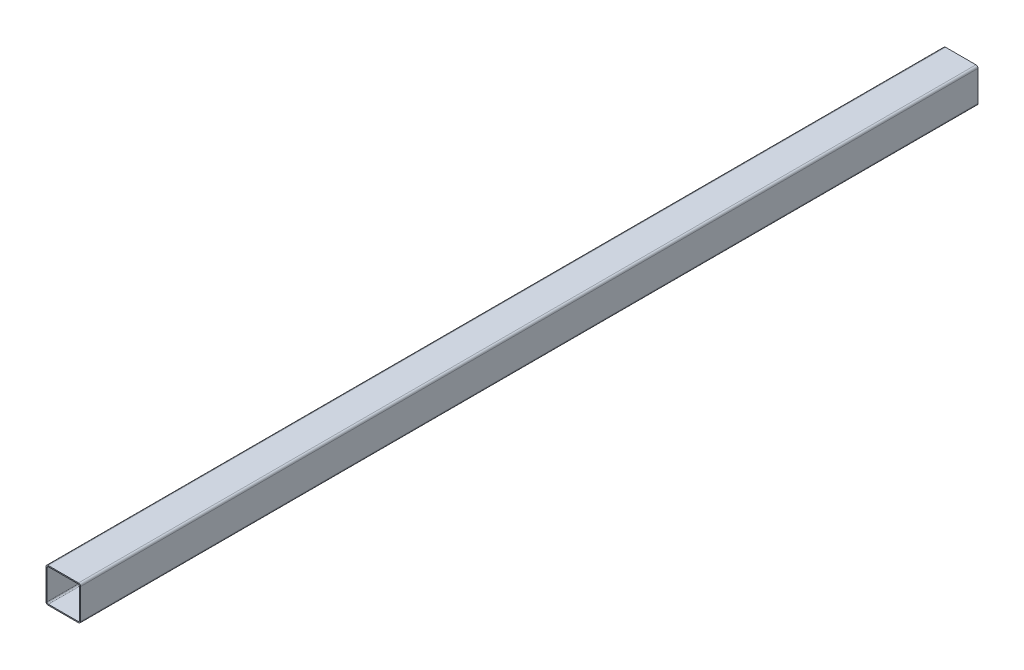
ISO-10303-21;
HEADER;
FILE_DESCRIPTION(('STEP AP214'),'2;1');
FILE_NAME('part.step','',(''),(''),'','','');
FILE_SCHEMA(('AUTOMOTIVE_DESIGN { 1 0 10303 214 1 1 1 1 }'));
ENDSEC;
DATA;
#1=APPLICATION_CONTEXT('core data for automotive mechanical design processes');
#2=APPLICATION_PROTOCOL_DEFINITION('international standard','automotive_design',2000,#1);
#3=PRODUCT_CONTEXT('',#1,'mechanical');
#4=PRODUCT('Part','Part','',(#3));
#5=PRODUCT_RELATED_PRODUCT_CATEGORY('part','',(#4));
#6=PRODUCT_DEFINITION_FORMATION('','',#4);
#7=PRODUCT_DEFINITION_CONTEXT('part definition',#1,'design');
#8=PRODUCT_DEFINITION('design','',#6,#7);
#9=PRODUCT_DEFINITION_SHAPE('','',#8);
#10=(LENGTH_UNIT() NAMED_UNIT(*) SI_UNIT(.MILLI.,.METRE.));
#11=(NAMED_UNIT(*) PLANE_ANGLE_UNIT() SI_UNIT($,.RADIAN.));
#12=(NAMED_UNIT(*) SI_UNIT($,.STERADIAN.) SOLID_ANGLE_UNIT());
#13=UNCERTAINTY_MEASURE_WITH_UNIT(LENGTH_MEASURE(1.E-05),#10,'distance_accuracy_value','');
#14=(GEOMETRIC_REPRESENTATION_CONTEXT(3) GLOBAL_UNCERTAINTY_ASSIGNED_CONTEXT((#13)) GLOBAL_UNIT_ASSIGNED_CONTEXT((#10,
#11,#12)) REPRESENTATION_CONTEXT('',''));
#15=CARTESIAN_POINT('',(0.,0.,0.));
#16=DIRECTION('',(0.,0.,1.));
#17=DIRECTION('',(1.,0.,0.));
#18=AXIS2_PLACEMENT_3D('',#15,#16,#17);
#19=CARTESIAN_POINT('',(-44.0000000000005,-43.9999999999965,-2600.));
#20=DIRECTION('',(0.,0.,1.));
#21=DIRECTION('',(1.,0.,0.));
#22=AXIS2_PLACEMENT_3D('',#19,#20,#21);
#23=CYLINDRICAL_SURFACE('',#22,6.00000000000014);
#24=CARTESIAN_POINT('',(-44.0000000000005,-43.9999999999965,0.));
#25=DIRECTION('',(0.,0.,1.));
#26=DIRECTION('',(1.,0.,0.));
#27=AXIS2_PLACEMENT_3D('',#24,#25,#26);
#28=CIRCLE('',#27,6.00000000000014);
#29=CARTESIAN_POINT('',(-50.0000000000007,-43.9999999999965,0.));
#30=VERTEX_POINT('',#29);
#31=CARTESIAN_POINT('',(-44.0000000000005,-49.9999999999966,0.));
#32=VERTEX_POINT('',#31);
#33=EDGE_CURVE('E205',#30,#32,#28,.T.);
#34=ORIENTED_EDGE('',*,*,#33,.F.);
#35=DIRECTION('',(0.,0.,1.));
#36=VECTOR('',#35,1.);
#37=CARTESIAN_POINT('',(-50.0000000000007,-43.9999999999965,-2600.));
#38=LINE('',#37,#36);
#39=CARTESIAN_POINT('',(-50.0000000000007,-43.9999999999965,-2600.));
#40=VERTEX_POINT('',#39);
#41=EDGE_CURVE('E11',#40,#30,#38,.T.);
#42=ORIENTED_EDGE('',*,*,#41,.F.);
#43=CARTESIAN_POINT('',(-44.0000000000005,-43.9999999999965,-2600.));
#44=DIRECTION('',(0.,0.,1.));
#45=DIRECTION('',(1.,0.,0.));
#46=AXIS2_PLACEMENT_3D('',#43,#44,#45);
#47=CIRCLE('',#46,6.00000000000014);
#48=CARTESIAN_POINT('',(-44.0000000000005,-49.9999999999966,-2600.));
#49=VERTEX_POINT('',#48);
#50=EDGE_CURVE('E217',#40,#49,#47,.T.);
#51=ORIENTED_EDGE('',*,*,#50,.T.);
#52=DIRECTION('',(0.,0.,1.));
#53=VECTOR('',#52,1.);
#54=CARTESIAN_POINT('',(-44.0000000000005,-49.9999999999966,-2600.));
#55=LINE('',#54,#53);
#56=EDGE_CURVE('E38',#49,#32,#55,.T.);
#57=ORIENTED_EDGE('',*,*,#56,.T.);
#58=EDGE_LOOP('',(#34,#42,#51,#57));
#59=FACE_BOUND('',#58,.T.);
#60=ADVANCED_FACE('F35',(#59),#23,.T.);
#61=CARTESIAN_POINT('',(-50.0000000000007,44.0000000000034,-2600.));
#62=DIRECTION('',(-1.,0.,0.));
#63=DIRECTION('',(0.,0.,1.));
#64=AXIS2_PLACEMENT_3D('',#61,#62,#63);
#65=PLANE('',#64);
#66=DIRECTION('',(0.,-1.,0.));
#67=VECTOR('',#66,1.);
#68=CARTESIAN_POINT('',(-50.0000000000007,44.0000000000034,0.));
#69=LINE('',#68,#67);
#70=CARTESIAN_POINT('',(-50.0000000000007,44.0000000000034,0.));
#71=VERTEX_POINT('',#70);
#72=EDGE_CURVE('E221',#71,#30,#69,.T.);
#73=ORIENTED_EDGE('',*,*,#72,.F.);
#74=DIRECTION('',(0.,0.,1.));
#75=VECTOR('',#74,1.);
#76=CARTESIAN_POINT('',(-50.0000000000007,44.0000000000034,-2600.));
#77=LINE('',#76,#75);
#78=CARTESIAN_POINT('',(-50.0000000000007,44.0000000000034,-2600.));
#79=VERTEX_POINT('',#78);
#80=EDGE_CURVE('E43',#79,#71,#77,.T.);
#81=ORIENTED_EDGE('',*,*,#80,.F.);
#82=DIRECTION('',(0.,-1.,0.));
#83=VECTOR('',#82,1.);
#84=CARTESIAN_POINT('',(-50.0000000000007,44.0000000000034,-2600.));
#85=LINE('',#84,#83);
#86=EDGE_CURVE('E239',#79,#40,#85,.T.);
#87=ORIENTED_EDGE('',*,*,#86,.T.);
#88=ORIENTED_EDGE('',*,*,#41,.T.);
#89=EDGE_LOOP('',(#73,#81,#87,#88));
#90=FACE_BOUND('',#89,.T.);
#91=ADVANCED_FACE('F286',(#90),#65,.T.);
#92=CARTESIAN_POINT('',(-44.0000000000005,44.0000000000034,-2600.));
#93=DIRECTION('',(0.,0.,1.));
#94=DIRECTION('',(1.,0.,0.));
#95=AXIS2_PLACEMENT_3D('',#92,#93,#94);
#96=CYLINDRICAL_SURFACE('',#95,6.00000000000014);
#97=CARTESIAN_POINT('',(-44.0000000000005,44.0000000000034,0.));
#98=DIRECTION('',(0.,0.,1.));
#99=DIRECTION('',(1.,0.,0.));
#100=AXIS2_PLACEMENT_3D('',#97,#98,#99);
#101=CIRCLE('',#100,6.00000000000014);
#102=CARTESIAN_POINT('',(-44.0000000000005,50.0000000000036,0.));
#103=VERTEX_POINT('',#102);
#104=EDGE_CURVE('E259',#103,#71,#101,.T.);
#105=ORIENTED_EDGE('',*,*,#104,.F.);
#106=DIRECTION('',(0.,0.,1.));
#107=VECTOR('',#106,1.);
#108=CARTESIAN_POINT('',(-44.0000000000005,50.0000000000036,-2600.));
#109=LINE('',#108,#107);
#110=CARTESIAN_POINT('',(-44.0000000000005,50.0000000000036,-2600.));
#111=VERTEX_POINT('',#110);
#112=EDGE_CURVE('E265',#111,#103,#109,.T.);
#113=ORIENTED_EDGE('',*,*,#112,.F.);
#114=CARTESIAN_POINT('',(-44.0000000000005,44.0000000000034,-2600.));
#115=DIRECTION('',(0.,0.,1.));
#116=DIRECTION('',(1.,0.,0.));
#117=AXIS2_PLACEMENT_3D('',#114,#115,#116);
#118=CIRCLE('',#117,6.00000000000014);
#119=EDGE_CURVE('E236',#111,#79,#118,.T.);
#120=ORIENTED_EDGE('',*,*,#119,.T.);
#121=ORIENTED_EDGE('',*,*,#80,.T.);
#122=EDGE_LOOP('',(#105,#113,#120,#121));
#123=FACE_BOUND('',#122,.T.);
#124=ADVANCED_FACE('F305',(#123),#96,.T.);
#125=CARTESIAN_POINT('',(-44.0000000000005,50.0000000000035,-2600.));
#126=DIRECTION('',(0.,1.,0.));
#127=DIRECTION('',(0.,0.,1.));
#128=AXIS2_PLACEMENT_3D('',#125,#126,#127);
#129=PLANE('',#128);
#130=DIRECTION('',(-1.,0.,0.));
#131=VECTOR('',#130,1.);
#132=CARTESIAN_POINT('',(-44.0000000000005,50.0000000000035,0.));
#133=LINE('',#132,#131);
#134=CARTESIAN_POINT('',(43.9999999999987,50.0000000000035,0.));
#135=VERTEX_POINT('',#134);
#136=EDGE_CURVE('E256',#135,#103,#133,.T.);
#137=ORIENTED_EDGE('',*,*,#136,.F.);
#138=DIRECTION('',(0.,0.,1.));
#139=VECTOR('',#138,1.);
#140=CARTESIAN_POINT('',(43.9999999999987,50.0000000000035,-2600.));
#141=LINE('',#140,#139);
#142=CARTESIAN_POINT('',(43.9999999999987,50.0000000000035,-2600.));
#143=VERTEX_POINT('',#142);
#144=EDGE_CURVE('E267',#143,#135,#141,.T.);
#145=ORIENTED_EDGE('',*,*,#144,.F.);
#146=DIRECTION('',(-1.,0.,0.));
#147=VECTOR('',#146,1.);
#148=CARTESIAN_POINT('',(-44.0000000000005,50.0000000000035,-2600.));
#149=LINE('',#148,#147);
#150=EDGE_CURVE('E233',#143,#111,#149,.T.);
#151=ORIENTED_EDGE('',*,*,#150,.T.);
#152=ORIENTED_EDGE('',*,*,#112,.T.);
#153=EDGE_LOOP('',(#137,#145,#151,#152));
#154=FACE_BOUND('',#153,.T.);
#155=ADVANCED_FACE('F303',(#154),#129,.T.);
#156=CARTESIAN_POINT('',(43.9999999999987,44.0000000000034,-2600.));
#157=DIRECTION('',(0.,0.,1.));
#158=DIRECTION('',(1.,0.,0.));
#159=AXIS2_PLACEMENT_3D('',#156,#157,#158);
#160=CYLINDRICAL_SURFACE('',#159,6.00000000000014);
#161=CARTESIAN_POINT('',(43.9999999999987,44.0000000000034,0.));
#162=DIRECTION('',(0.,0.,1.));
#163=DIRECTION('',(-1.,0.,0.));
#164=AXIS2_PLACEMENT_3D('',#161,#162,#163);
#165=CIRCLE('',#164,6.00000000000014);
#166=CARTESIAN_POINT('',(49.9999999999988,44.0000000000034,0.));
#167=VERTEX_POINT('',#166);
#168=EDGE_CURVE('E253',#167,#135,#165,.T.);
#169=ORIENTED_EDGE('',*,*,#168,.F.);
#170=DIRECTION('',(0.,0.,1.));
#171=VECTOR('',#170,1.);
#172=CARTESIAN_POINT('',(49.9999999999988,44.0000000000034,-2600.));
#173=LINE('',#172,#171);
#174=CARTESIAN_POINT('',(49.9999999999988,44.0000000000034,-2600.));
#175=VERTEX_POINT('',#174);
#176=EDGE_CURVE('E269',#175,#167,#173,.T.);
#177=ORIENTED_EDGE('',*,*,#176,.F.);
#178=CARTESIAN_POINT('',(43.9999999999987,44.0000000000034,-2600.));
#179=DIRECTION('',(0.,0.,1.));
#180=DIRECTION('',(-1.,0.,0.));
#181=AXIS2_PLACEMENT_3D('',#178,#179,#180);
#182=CIRCLE('',#181,6.00000000000014);
#183=EDGE_CURVE('E230',#175,#143,#182,.T.);
#184=ORIENTED_EDGE('',*,*,#183,.T.);
#185=ORIENTED_EDGE('',*,*,#144,.T.);
#186=EDGE_LOOP('',(#169,#177,#184,#185));
#187=FACE_BOUND('',#186,.T.);
#188=ADVANCED_FACE('F299',(#187),#160,.T.);
#189=CARTESIAN_POINT('',(49.9999999999989,44.0000000000034,-2600.));
#190=DIRECTION('',(1.,0.,0.));
#191=DIRECTION('',(0.,0.,-1.));
#192=AXIS2_PLACEMENT_3D('',#189,#190,#191);
#193=PLANE('',#192);
#194=DIRECTION('',(0.,1.,0.));
#195=VECTOR('',#194,1.);
#196=CARTESIAN_POINT('',(49.9999999999989,44.0000000000034,0.));
#197=LINE('',#196,#195);
#198=CARTESIAN_POINT('',(49.9999999999989,-43.9999999999965,0.));
#199=VERTEX_POINT('',#198);
#200=EDGE_CURVE('E250',#199,#167,#197,.T.);
#201=ORIENTED_EDGE('',*,*,#200,.F.);
#202=DIRECTION('',(0.,0.,1.));
#203=VECTOR('',#202,1.);
#204=CARTESIAN_POINT('',(49.9999999999989,-43.9999999999965,-2600.));
#205=LINE('',#204,#203);
#206=CARTESIAN_POINT('',(49.9999999999989,-43.9999999999965,-2600.));
#207=VERTEX_POINT('',#206);
#208=EDGE_CURVE('E271',#207,#199,#205,.T.);
#209=ORIENTED_EDGE('',*,*,#208,.F.);
#210=DIRECTION('',(0.,1.,0.));
#211=VECTOR('',#210,1.);
#212=CARTESIAN_POINT('',(49.9999999999989,44.0000000000034,-2600.));
#213=LINE('',#212,#211);
#214=EDGE_CURVE('E227',#207,#175,#213,.T.);
#215=ORIENTED_EDGE('',*,*,#214,.T.);
#216=ORIENTED_EDGE('',*,*,#176,.T.);
#217=EDGE_LOOP('',(#201,#209,#215,#216));
#218=FACE_BOUND('',#217,.T.);
#219=ADVANCED_FACE('F297',(#218),#193,.T.);
#220=CARTESIAN_POINT('',(43.9999999999987,-43.9999999999965,-2600.));
#221=DIRECTION('',(0.,0.,1.));
#222=DIRECTION('',(1.,0.,0.));
#223=AXIS2_PLACEMENT_3D('',#220,#221,#222);
#224=CYLINDRICAL_SURFACE('',#223,6.00000000000014);
#225=CARTESIAN_POINT('',(43.9999999999987,-43.9999999999965,0.));
#226=DIRECTION('',(0.,0.,1.));
#227=DIRECTION('',(1.,0.,0.));
#228=AXIS2_PLACEMENT_3D('',#225,#226,#227);
#229=CIRCLE('',#228,6.00000000000014);
#230=CARTESIAN_POINT('',(43.9999999999987,-49.9999999999967,0.));
#231=VERTEX_POINT('',#230);
#232=EDGE_CURVE('E247',#231,#199,#229,.T.);
#233=ORIENTED_EDGE('',*,*,#232,.F.);
#234=DIRECTION('',(0.,0.,1.));
#235=VECTOR('',#234,1.);
#236=CARTESIAN_POINT('',(43.9999999999987,-49.9999999999967,-2600.));
#237=LINE('',#236,#235);
#238=CARTESIAN_POINT('',(43.9999999999987,-49.9999999999967,-2600.));
#239=VERTEX_POINT('',#238);
#240=EDGE_CURVE('E272',#239,#231,#237,.T.);
#241=ORIENTED_EDGE('',*,*,#240,.F.);
#242=CARTESIAN_POINT('',(43.9999999999987,-43.9999999999965,-2600.));
#243=DIRECTION('',(0.,0.,1.));
#244=DIRECTION('',(1.,0.,0.));
#245=AXIS2_PLACEMENT_3D('',#242,#243,#244);
#246=CIRCLE('',#245,6.00000000000014);
#247=EDGE_CURVE('E224',#239,#207,#246,.T.);
#248=ORIENTED_EDGE('',*,*,#247,.T.);
#249=ORIENTED_EDGE('',*,*,#208,.T.);
#250=EDGE_LOOP('',(#233,#241,#248,#249));
#251=FACE_BOUND('',#250,.T.);
#252=ADVANCED_FACE('F293',(#251),#224,.T.);
#253=CARTESIAN_POINT('',(-44.0000000000005,-49.9999999999966,-2600.));
#254=DIRECTION('',(0.,-1.,0.));
#255=DIRECTION('',(0.,0.,-1.));
#256=AXIS2_PLACEMENT_3D('',#253,#254,#255);
#257=PLANE('',#256);
#258=DIRECTION('',(1.,0.,0.));
#259=VECTOR('',#258,1.);
#260=CARTESIAN_POINT('',(-44.0000000000005,-49.9999999999966,0.));
#261=LINE('',#260,#259);
#262=EDGE_CURVE('E244',#32,#231,#261,.T.);
#263=ORIENTED_EDGE('',*,*,#262,.F.);
#264=ORIENTED_EDGE('',*,*,#56,.F.);
#265=DIRECTION('',(1.,0.,0.));
#266=VECTOR('',#265,1.);
#267=CARTESIAN_POINT('',(-44.0000000000005,-49.9999999999966,-2600.));
#268=LINE('',#267,#266);
#269=EDGE_CURVE('E220',#49,#239,#268,.T.);
#270=ORIENTED_EDGE('',*,*,#269,.T.);
#271=ORIENTED_EDGE('',*,*,#240,.T.);
#272=EDGE_LOOP('',(#263,#264,#270,#271));
#273=FACE_BOUND('',#272,.T.);
#274=ADVANCED_FACE('F280',(#273),#257,.T.);
#275=CARTESIAN_POINT('',(-44.0000000000005,-43.9999999999965,-2600.));
#276=DIRECTION('',(0.,0.,1.));
#277=DIRECTION('',(1.,0.,0.));
#278=AXIS2_PLACEMENT_3D('',#275,#276,#277);
#279=PLANE('',#278);
#280=DIRECTION('',(0.,-1.,0.));
#281=VECTOR('',#280,1.);
#282=CARTESIAN_POINT('',(-47.0000000000009,43.0000000000035,-2600.));
#283=LINE('',#282,#281);
#284=CARTESIAN_POINT('',(-47.0000000000009,43.0000000000035,-2600.));
#285=VERTEX_POINT('',#284);
#286=CARTESIAN_POINT('',(-47.0000000000009,-42.9999999999966,-2600.));
#287=VERTEX_POINT('',#286);
#288=EDGE_CURVE('E156',#285,#287,#283,.T.);
#289=ORIENTED_EDGE('',*,*,#288,.T.);
#290=CARTESIAN_POINT('',(-43.0000000000009,-42.9999999999966,-2600.));
#291=DIRECTION('',(0.,0.,1.));
#292=DIRECTION('',(1.,0.,0.));
#293=AXIS2_PLACEMENT_3D('',#290,#291,#292);
#294=CIRCLE('',#293,4.);
#295=CARTESIAN_POINT('',(-43.0000000000009,-46.9999999999966,-2600.));
#296=VERTEX_POINT('',#295);
#297=EDGE_CURVE('E150',#287,#296,#294,.T.);
#298=ORIENTED_EDGE('',*,*,#297,.T.);
#299=DIRECTION('',(1.,0.,0.));
#300=VECTOR('',#299,1.);
#301=CARTESIAN_POINT('',(-43.0000000000009,-46.9999999999966,-2600.));
#302=LINE('',#301,#300);
#303=CARTESIAN_POINT('',(42.9999999999991,-46.9999999999966,-2600.));
#304=VERTEX_POINT('',#303);
#305=EDGE_CURVE('E159',#296,#304,#302,.T.);
#306=ORIENTED_EDGE('',*,*,#305,.T.);
#307=CARTESIAN_POINT('',(42.9999999999991,-42.9999999999966,-2600.));
#308=DIRECTION('',(0.,0.,1.));
#309=DIRECTION('',(1.,0.,0.));
#310=AXIS2_PLACEMENT_3D('',#307,#308,#309);
#311=CIRCLE('',#310,4.);
#312=CARTESIAN_POINT('',(46.9999999999991,-42.9999999999966,-2600.));
#313=VERTEX_POINT('',#312);
#314=EDGE_CURVE('E51',#304,#313,#311,.T.);
#315=ORIENTED_EDGE('',*,*,#314,.T.);
#316=DIRECTION('',(0.,1.,0.));
#317=VECTOR('',#316,1.);
#318=CARTESIAN_POINT('',(46.9999999999991,43.0000000000035,-2600.));
#319=LINE('',#318,#317);
#320=CARTESIAN_POINT('',(46.9999999999991,43.0000000000035,-2600.));
#321=VERTEX_POINT('',#320);
#322=EDGE_CURVE('E174',#313,#321,#319,.T.);
#323=ORIENTED_EDGE('',*,*,#322,.T.);
#324=CARTESIAN_POINT('',(42.9999999999991,43.0000000000035,-2600.));
#325=DIRECTION('',(0.,0.,1.));
#326=DIRECTION('',(-1.,0.,0.));
#327=AXIS2_PLACEMENT_3D('',#324,#325,#326);
#328=CIRCLE('',#327,4.);
#329=CARTESIAN_POINT('',(42.9999999999991,47.0000000000035,-2600.));
#330=VERTEX_POINT('',#329);
#331=EDGE_CURVE('E177',#321,#330,#328,.T.);
#332=ORIENTED_EDGE('',*,*,#331,.T.);
#333=DIRECTION('',(-1.,0.,0.));
#334=VECTOR('',#333,1.);
#335=CARTESIAN_POINT('',(-43.0000000000009,47.0000000000035,-2600.));
#336=LINE('',#335,#334);
#337=CARTESIAN_POINT('',(-43.0000000000009,47.0000000000035,-2600.));
#338=VERTEX_POINT('',#337);
#339=EDGE_CURVE('E180',#330,#338,#336,.T.);
#340=ORIENTED_EDGE('',*,*,#339,.T.);
#341=CARTESIAN_POINT('',(-43.0000000000009,43.0000000000035,-2600.));
#342=DIRECTION('',(0.,0.,1.));
#343=DIRECTION('',(1.,0.,0.));
#344=AXIS2_PLACEMENT_3D('',#341,#342,#343);
#345=CIRCLE('',#344,4.);
#346=EDGE_CURVE('E183',#338,#285,#345,.T.);
#347=ORIENTED_EDGE('',*,*,#346,.T.);
#348=EDGE_LOOP('',(#289,#298,#306,#315,#323,#332,#340,#347));
#349=FACE_BOUND('',#348,.T.);
#350=ORIENTED_EDGE('',*,*,#50,.F.);
#351=ORIENTED_EDGE('',*,*,#86,.F.);
#352=ORIENTED_EDGE('',*,*,#119,.F.);
#353=ORIENTED_EDGE('',*,*,#150,.F.);
#354=ORIENTED_EDGE('',*,*,#183,.F.);
#355=ORIENTED_EDGE('',*,*,#214,.F.);
#356=ORIENTED_EDGE('',*,*,#247,.F.);
#357=ORIENTED_EDGE('',*,*,#269,.F.);
#358=EDGE_LOOP('',(#350,#351,#352,#353,#354,#355,#356,#357));
#359=FACE_BOUND('',#358,.T.);
#360=ADVANCED_FACE('F163',(#349,#359),#279,.F.);
#361=CARTESIAN_POINT('',(-44.0000000000005,-43.9999999999965,0.));
#362=DIRECTION('',(0.,0.,1.));
#363=DIRECTION('',(1.,0.,0.));
#364=AXIS2_PLACEMENT_3D('',#361,#362,#363);
#365=PLANE('',#364);
#366=CARTESIAN_POINT('',(-43.0000000000009,-42.9999999999966,0.));
#367=DIRECTION('',(0.,0.,1.));
#368=DIRECTION('',(1.,0.,0.));
#369=AXIS2_PLACEMENT_3D('',#366,#367,#368);
#370=CIRCLE('',#369,4.);
#371=CARTESIAN_POINT('',(-47.0000000000009,-42.9999999999966,0.));
#372=VERTEX_POINT('',#371);
#373=CARTESIAN_POINT('',(-43.0000000000009,-46.9999999999966,0.));
#374=VERTEX_POINT('',#373);
#375=EDGE_CURVE('E59',#372,#374,#370,.T.);
#376=ORIENTED_EDGE('',*,*,#375,.F.);
#377=DIRECTION('',(0.,-1.,0.));
#378=VECTOR('',#377,1.);
#379=CARTESIAN_POINT('',(-47.0000000000009,43.0000000000035,0.));
#380=LINE('',#379,#378);
#381=CARTESIAN_POINT('',(-47.0000000000009,43.0000000000035,0.));
#382=VERTEX_POINT('',#381);
#383=EDGE_CURVE('E167',#382,#372,#380,.T.);
#384=ORIENTED_EDGE('',*,*,#383,.F.);
#385=CARTESIAN_POINT('',(-43.0000000000009,43.0000000000035,0.));
#386=DIRECTION('',(0.,0.,1.));
#387=DIRECTION('',(1.,0.,0.));
#388=AXIS2_PLACEMENT_3D('',#385,#386,#387);
#389=CIRCLE('',#388,4.);
#390=CARTESIAN_POINT('',(-43.0000000000009,47.0000000000035,0.));
#391=VERTEX_POINT('',#390);
#392=EDGE_CURVE('E170',#391,#382,#389,.T.);
#393=ORIENTED_EDGE('',*,*,#392,.F.);
#394=DIRECTION('',(-1.,0.,0.));
#395=VECTOR('',#394,1.);
#396=CARTESIAN_POINT('',(-43.0000000000009,47.0000000000035,0.));
#397=LINE('',#396,#395);
#398=CARTESIAN_POINT('',(42.9999999999991,47.0000000000035,0.));
#399=VERTEX_POINT('',#398);
#400=EDGE_CURVE('E198',#399,#391,#397,.T.);
#401=ORIENTED_EDGE('',*,*,#400,.F.);
#402=CARTESIAN_POINT('',(42.9999999999991,43.0000000000035,0.));
#403=DIRECTION('',(0.,0.,1.));
#404=DIRECTION('',(-1.,0.,0.));
#405=AXIS2_PLACEMENT_3D('',#402,#403,#404);
#406=CIRCLE('',#405,4.);
#407=CARTESIAN_POINT('',(46.9999999999991,43.0000000000035,0.));
#408=VERTEX_POINT('',#407);
#409=EDGE_CURVE('E195',#408,#399,#406,.T.);
#410=ORIENTED_EDGE('',*,*,#409,.F.);
#411=DIRECTION('',(0.,1.,0.));
#412=VECTOR('',#411,1.);
#413=CARTESIAN_POINT('',(46.9999999999991,43.0000000000035,0.));
#414=LINE('',#413,#412);
#415=CARTESIAN_POINT('',(46.9999999999991,-42.9999999999966,0.));
#416=VERTEX_POINT('',#415);
#417=EDGE_CURVE('E192',#416,#408,#414,.T.);
#418=ORIENTED_EDGE('',*,*,#417,.F.);
#419=CARTESIAN_POINT('',(42.9999999999991,-42.9999999999966,0.));
#420=DIRECTION('',(0.,0.,1.));
#421=DIRECTION('',(1.,0.,0.));
#422=AXIS2_PLACEMENT_3D('',#419,#420,#421);
#423=CIRCLE('',#422,4.);
#424=CARTESIAN_POINT('',(42.9999999999991,-46.9999999999966,0.));
#425=VERTEX_POINT('',#424);
#426=EDGE_CURVE('E189',#425,#416,#423,.T.);
#427=ORIENTED_EDGE('',*,*,#426,.F.);
#428=DIRECTION('',(1.,0.,0.));
#429=VECTOR('',#428,1.);
#430=CARTESIAN_POINT('',(-43.0000000000009,-46.9999999999966,0.));
#431=LINE('',#430,#429);
#432=EDGE_CURVE('E187',#374,#425,#431,.T.);
#433=ORIENTED_EDGE('',*,*,#432,.F.);
#434=EDGE_LOOP('',(#376,#384,#393,#401,#410,#418,#427,#433));
#435=FACE_BOUND('',#434,.T.);
#436=ORIENTED_EDGE('',*,*,#33,.T.);
#437=ORIENTED_EDGE('',*,*,#262,.T.);
#438=ORIENTED_EDGE('',*,*,#232,.T.);
#439=ORIENTED_EDGE('',*,*,#200,.T.);
#440=ORIENTED_EDGE('',*,*,#168,.T.);
#441=ORIENTED_EDGE('',*,*,#136,.T.);
#442=ORIENTED_EDGE('',*,*,#104,.T.);
#443=ORIENTED_EDGE('',*,*,#72,.T.);
#444=EDGE_LOOP('',(#436,#437,#438,#439,#440,#441,#442,#443));
#445=FACE_BOUND('',#444,.T.);
#446=ADVANCED_FACE('F282',(#435,#445),#365,.T.);
#447=CARTESIAN_POINT('',(-43.0000000000009,-42.9999999999966,-2600.));
#448=DIRECTION('',(0.,0.,1.));
#449=DIRECTION('',(1.,0.,0.));
#450=AXIS2_PLACEMENT_3D('',#447,#448,#449);
#451=CYLINDRICAL_SURFACE('',#450,4.);
#452=ORIENTED_EDGE('',*,*,#375,.T.);
#453=DIRECTION('',(0.,0.,1.));
#454=VECTOR('',#453,1.);
#455=CARTESIAN_POINT('',(-43.0000000000009,-46.9999999999966,-2600.));
#456=LINE('',#455,#454);
#457=EDGE_CURVE('E146',#296,#374,#456,.T.);
#458=ORIENTED_EDGE('',*,*,#457,.F.);
#459=ORIENTED_EDGE('',*,*,#297,.F.);
#460=DIRECTION('',(0.,0.,1.));
#461=VECTOR('',#460,1.);
#462=CARTESIAN_POINT('',(-47.0000000000009,-42.9999999999966,-2600.));
#463=LINE('',#462,#461);
#464=EDGE_CURVE('E203',#287,#372,#463,.T.);
#465=ORIENTED_EDGE('',*,*,#464,.T.);
#466=EDGE_LOOP('',(#452,#458,#459,#465));
#467=FACE_BOUND('',#466,.T.);
#468=ADVANCED_FACE('F148',(#467),#451,.F.);
#469=CARTESIAN_POINT('',(-47.0000000000009,43.0000000000035,-2600.));
#470=DIRECTION('',(-1.,0.,0.));
#471=DIRECTION('',(0.,0.,1.));
#472=AXIS2_PLACEMENT_3D('',#469,#470,#471);
#473=PLANE('',#472);
#474=ORIENTED_EDGE('',*,*,#383,.T.);
#475=ORIENTED_EDGE('',*,*,#464,.F.);
#476=ORIENTED_EDGE('',*,*,#288,.F.);
#477=DIRECTION('',(0.,0.,1.));
#478=VECTOR('',#477,1.);
#479=CARTESIAN_POINT('',(-47.0000000000009,43.0000000000035,-2600.));
#480=LINE('',#479,#478);
#481=EDGE_CURVE('E206',#285,#382,#480,.T.);
#482=ORIENTED_EDGE('',*,*,#481,.T.);
#483=EDGE_LOOP('',(#474,#475,#476,#482));
#484=FACE_BOUND('',#483,.T.);
#485=ADVANCED_FACE('F388',(#484),#473,.F.);
#486=CARTESIAN_POINT('',(-43.0000000000009,43.0000000000035,-2600.));
#487=DIRECTION('',(0.,0.,1.));
#488=DIRECTION('',(1.,0.,0.));
#489=AXIS2_PLACEMENT_3D('',#486,#487,#488);
#490=CYLINDRICAL_SURFACE('',#489,4.);
#491=ORIENTED_EDGE('',*,*,#392,.T.);
#492=ORIENTED_EDGE('',*,*,#481,.F.);
#493=ORIENTED_EDGE('',*,*,#346,.F.);
#494=DIRECTION('',(0.,0.,1.));
#495=VECTOR('',#494,1.);
#496=CARTESIAN_POINT('',(-43.0000000000009,47.0000000000035,-2600.));
#497=LINE('',#496,#495);
#498=EDGE_CURVE('E208',#338,#391,#497,.T.);
#499=ORIENTED_EDGE('',*,*,#498,.T.);
#500=EDGE_LOOP('',(#491,#492,#493,#499));
#501=FACE_BOUND('',#500,.T.);
#502=ADVANCED_FACE('F397',(#501),#490,.F.);
#503=CARTESIAN_POINT('',(-43.0000000000009,47.0000000000035,-2600.));
#504=DIRECTION('',(0.,1.,0.));
#505=DIRECTION('',(0.,0.,1.));
#506=AXIS2_PLACEMENT_3D('',#503,#504,#505);
#507=PLANE('',#506);
#508=ORIENTED_EDGE('',*,*,#400,.T.);
#509=ORIENTED_EDGE('',*,*,#498,.F.);
#510=ORIENTED_EDGE('',*,*,#339,.F.);
#511=DIRECTION('',(0.,0.,1.));
#512=VECTOR('',#511,1.);
#513=CARTESIAN_POINT('',(42.9999999999991,47.0000000000035,-2600.));
#514=LINE('',#513,#512);
#515=EDGE_CURVE('E210',#330,#399,#514,.T.);
#516=ORIENTED_EDGE('',*,*,#515,.T.);
#517=EDGE_LOOP('',(#508,#509,#510,#516));
#518=FACE_BOUND('',#517,.T.);
#519=ADVANCED_FACE('F407',(#518),#507,.F.);
#520=CARTESIAN_POINT('',(42.9999999999991,43.0000000000035,-2600.));
#521=DIRECTION('',(0.,0.,1.));
#522=DIRECTION('',(1.,0.,0.));
#523=AXIS2_PLACEMENT_3D('',#520,#521,#522);
#524=CYLINDRICAL_SURFACE('',#523,4.);
#525=ORIENTED_EDGE('',*,*,#409,.T.);
#526=ORIENTED_EDGE('',*,*,#515,.F.);
#527=ORIENTED_EDGE('',*,*,#331,.F.);
#528=DIRECTION('',(0.,0.,1.));
#529=VECTOR('',#528,1.);
#530=CARTESIAN_POINT('',(46.9999999999991,43.0000000000035,-2600.));
#531=LINE('',#530,#529);
#532=EDGE_CURVE('E212',#321,#408,#531,.T.);
#533=ORIENTED_EDGE('',*,*,#532,.T.);
#534=EDGE_LOOP('',(#525,#526,#527,#533));
#535=FACE_BOUND('',#534,.T.);
#536=ADVANCED_FACE('F417',(#535),#524,.F.);
#537=CARTESIAN_POINT('',(46.9999999999991,43.0000000000035,-2600.));
#538=DIRECTION('',(1.,0.,0.));
#539=DIRECTION('',(0.,0.,-1.));
#540=AXIS2_PLACEMENT_3D('',#537,#538,#539);
#541=PLANE('',#540);
#542=ORIENTED_EDGE('',*,*,#417,.T.);
#543=ORIENTED_EDGE('',*,*,#532,.F.);
#544=ORIENTED_EDGE('',*,*,#322,.F.);
#545=DIRECTION('',(0.,0.,1.));
#546=VECTOR('',#545,1.);
#547=CARTESIAN_POINT('',(46.9999999999991,-42.9999999999966,-2600.));
#548=LINE('',#547,#546);
#549=EDGE_CURVE('E214',#313,#416,#548,.T.);
#550=ORIENTED_EDGE('',*,*,#549,.T.);
#551=EDGE_LOOP('',(#542,#543,#544,#550));
#552=FACE_BOUND('',#551,.T.);
#553=ADVANCED_FACE('F427',(#552),#541,.F.);
#554=CARTESIAN_POINT('',(42.9999999999991,-42.9999999999966,-2600.));
#555=DIRECTION('',(0.,0.,1.));
#556=DIRECTION('',(1.,0.,0.));
#557=AXIS2_PLACEMENT_3D('',#554,#555,#556);
#558=CYLINDRICAL_SURFACE('',#557,4.);
#559=ORIENTED_EDGE('',*,*,#426,.T.);
#560=ORIENTED_EDGE('',*,*,#549,.F.);
#561=ORIENTED_EDGE('',*,*,#314,.F.);
#562=DIRECTION('',(0.,0.,1.));
#563=VECTOR('',#562,1.);
#564=CARTESIAN_POINT('',(42.9999999999991,-46.9999999999966,-2600.));
#565=LINE('',#564,#563);
#566=EDGE_CURVE('E155',#304,#425,#565,.T.);
#567=ORIENTED_EDGE('',*,*,#566,.T.);
#568=EDGE_LOOP('',(#559,#560,#561,#567));
#569=FACE_BOUND('',#568,.T.);
#570=ADVANCED_FACE('F437',(#569),#558,.F.);
#571=CARTESIAN_POINT('',(-43.0000000000009,-46.9999999999966,-2600.));
#572=DIRECTION('',(0.,-1.,0.));
#573=DIRECTION('',(0.,0.,-1.));
#574=AXIS2_PLACEMENT_3D('',#571,#572,#573);
#575=PLANE('',#574);
#576=ORIENTED_EDGE('',*,*,#432,.T.);
#577=ORIENTED_EDGE('',*,*,#566,.F.);
#578=ORIENTED_EDGE('',*,*,#305,.F.);
#579=ORIENTED_EDGE('',*,*,#457,.T.);
#580=EDGE_LOOP('',(#576,#577,#578,#579));
#581=FACE_BOUND('',#580,.T.);
#582=ADVANCED_FACE('F160',(#581),#575,.F.);
#583=CLOSED_SHELL('',(#60,#91,#124,#155,#188,#219,#252,#274,#360,#446,#468,#485,#502,#519,#536,
#553,#570,#582));
#584=MANIFOLD_SOLID_BREP('B2',#583);
#585=ADVANCED_BREP_SHAPE_REPRESENTATION('',(#18,#584),#14);
#586=SHAPE_DEFINITION_REPRESENTATION(#9,#585);
ENDSEC;
END-ISO-10303-21;
